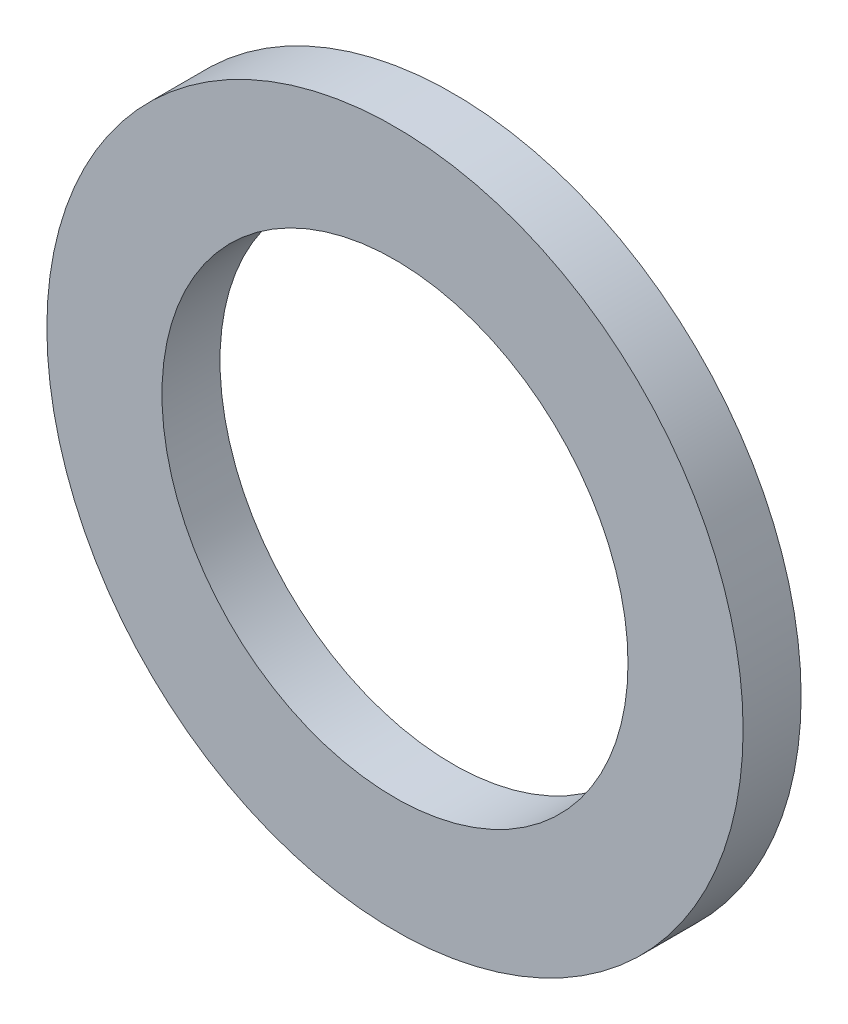
ISO-10303-21;
HEADER;
FILE_DESCRIPTION(('STEP AP214'),'2;1');
FILE_NAME('part.step','',(''),(''),'','','');
FILE_SCHEMA(('AUTOMOTIVE_DESIGN { 1 0 10303 214 1 1 1 1 }'));
ENDSEC;
DATA;
#1=APPLICATION_CONTEXT('core data for automotive mechanical design processes');
#2=APPLICATION_PROTOCOL_DEFINITION('international standard','automotive_design',2000,#1);
#3=PRODUCT_CONTEXT('',#1,'mechanical');
#4=PRODUCT('Part','Part','',(#3));
#5=PRODUCT_RELATED_PRODUCT_CATEGORY('part','',(#4));
#6=PRODUCT_DEFINITION_FORMATION('','',#4);
#7=PRODUCT_DEFINITION_CONTEXT('part definition',#1,'design');
#8=PRODUCT_DEFINITION('design','',#6,#7);
#9=PRODUCT_DEFINITION_SHAPE('','',#8);
#10=(LENGTH_UNIT() NAMED_UNIT(*) SI_UNIT(.MILLI.,.METRE.));
#11=(NAMED_UNIT(*) PLANE_ANGLE_UNIT() SI_UNIT($,.RADIAN.));
#12=(NAMED_UNIT(*) SI_UNIT($,.STERADIAN.) SOLID_ANGLE_UNIT());
#13=UNCERTAINTY_MEASURE_WITH_UNIT(LENGTH_MEASURE(1.E-05),#10,'distance_accuracy_value','');
#14=(GEOMETRIC_REPRESENTATION_CONTEXT(3) GLOBAL_UNCERTAINTY_ASSIGNED_CONTEXT((#13)) GLOBAL_UNIT_ASSIGNED_CONTEXT((#10,
#11,#12)) REPRESENTATION_CONTEXT('',''));
#15=CARTESIAN_POINT('',(0.,0.,0.));
#16=DIRECTION('',(0.,0.,1.));
#17=DIRECTION('',(1.,0.,0.));
#18=AXIS2_PLACEMENT_3D('',#15,#16,#17);
#19=CARTESIAN_POINT('',(0.,0.,0.79375));
#20=DIRECTION('',(0.,0.,1.));
#21=DIRECTION('',(1.,0.,0.));
#22=AXIS2_PLACEMENT_3D('',#19,#20,#21);
#23=PLANE('',#22);
#24=CARTESIAN_POINT('',(0.,0.,0.79375));
#25=DIRECTION('',(0.,0.,1.));
#26=DIRECTION('',(1.,0.,0.));
#27=AXIS2_PLACEMENT_3D('',#24,#25,#26);
#28=CIRCLE('',#27,9.525);
#29=CARTESIAN_POINT('',(9.525,0.,0.79375));
#30=VERTEX_POINT('',#29);
#31=EDGE_CURVE('E10',#30,#30,#28,.T.);
#32=ORIENTED_EDGE('',*,*,#31,.T.);
#33=EDGE_LOOP('',(#32));
#34=FACE_BOUND('',#33,.T.);
#35=CARTESIAN_POINT('',(0.,0.,0.79375));
#36=DIRECTION('',(0.,0.,1.));
#37=DIRECTION('',(1.,0.,0.));
#38=AXIS2_PLACEMENT_3D('',#35,#36,#37);
#39=CIRCLE('',#38,6.3754);
#40=CARTESIAN_POINT('',(6.3754,0.,0.79375));
#41=VERTEX_POINT('',#40);
#42=EDGE_CURVE('E41',#41,#41,#39,.T.);
#43=ORIENTED_EDGE('',*,*,#42,.F.);
#44=EDGE_LOOP('',(#43));
#45=FACE_BOUND('',#44,.T.);
#46=ADVANCED_FACE('F30',(#34,#45),#23,.T.);
#47=CARTESIAN_POINT('',(0.,0.,-0.79375));
#48=DIRECTION('',(0.,0.,1.));
#49=DIRECTION('',(1.,0.,0.));
#50=AXIS2_PLACEMENT_3D('',#47,#48,#49);
#51=PLANE('',#50);
#52=CARTESIAN_POINT('',(0.,0.,-0.79375));
#53=DIRECTION('',(0.,0.,1.));
#54=DIRECTION('',(1.,0.,0.));
#55=AXIS2_PLACEMENT_3D('',#52,#53,#54);
#56=CIRCLE('',#55,9.525);
#57=CARTESIAN_POINT('',(9.525,0.,-0.79375));
#58=VERTEX_POINT('',#57);
#59=EDGE_CURVE('E34',#58,#58,#56,.T.);
#60=ORIENTED_EDGE('',*,*,#59,.F.);
#61=EDGE_LOOP('',(#60));
#62=FACE_BOUND('',#61,.T.);
#63=CARTESIAN_POINT('',(0.,0.,-0.79375));
#64=DIRECTION('',(0.,0.,1.));
#65=DIRECTION('',(1.,0.,0.));
#66=AXIS2_PLACEMENT_3D('',#63,#64,#65);
#67=CIRCLE('',#66,6.3754);
#68=CARTESIAN_POINT('',(6.3754,0.,-0.79375));
#69=VERTEX_POINT('',#68);
#70=EDGE_CURVE('E43',#69,#69,#67,.T.);
#71=ORIENTED_EDGE('',*,*,#70,.T.);
#72=EDGE_LOOP('',(#71));
#73=FACE_BOUND('',#72,.T.);
#74=ADVANCED_FACE('F53',(#62,#73),#51,.F.);
#75=CARTESIAN_POINT('',(0.,0.,0.79375));
#76=DIRECTION('',(0.,0.,-1.));
#77=DIRECTION('',(-1.,0.,0.));
#78=AXIS2_PLACEMENT_3D('',#75,#76,#77);
#79=CYLINDRICAL_SURFACE('',#78,9.525);
#80=ORIENTED_EDGE('',*,*,#31,.F.);
#81=EDGE_LOOP('',(#80));
#82=FACE_BOUND('',#81,.T.);
#83=ORIENTED_EDGE('',*,*,#59,.T.);
#84=EDGE_LOOP('',(#83));
#85=FACE_BOUND('',#84,.T.);
#86=ADVANCED_FACE('F32',(#82,#85),#79,.T.);
#87=CARTESIAN_POINT('',(0.,0.,0.79375));
#88=DIRECTION('',(0.,0.,-1.));
#89=DIRECTION('',(-1.,0.,0.));
#90=AXIS2_PLACEMENT_3D('',#87,#88,#89);
#91=CYLINDRICAL_SURFACE('',#90,6.3754);
#92=ORIENTED_EDGE('',*,*,#42,.T.);
#93=EDGE_LOOP('',(#92));
#94=FACE_BOUND('',#93,.T.);
#95=ORIENTED_EDGE('',*,*,#70,.F.);
#96=EDGE_LOOP('',(#95));
#97=FACE_BOUND('',#96,.T.);
#98=ADVANCED_FACE('F49',(#94,#97),#91,.F.);
#99=CLOSED_SHELL('',(#46,#74,#86,#98));
#100=MANIFOLD_SOLID_BREP('B2',#99);
#101=ADVANCED_BREP_SHAPE_REPRESENTATION('',(#18,#100),#14);
#102=SHAPE_DEFINITION_REPRESENTATION(#9,#101);
ENDSEC;
END-ISO-10303-21;
